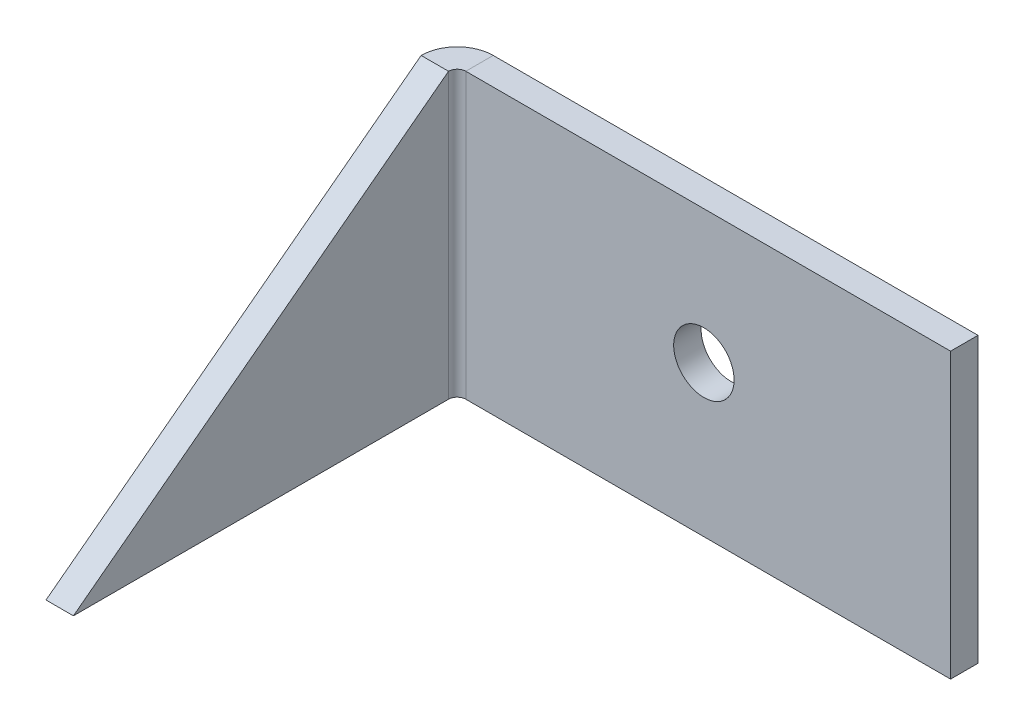
ISO-10303-21;
HEADER;
FILE_DESCRIPTION(('STEP AP214'),'2;1');
FILE_NAME('part.step','',(''),(''),'','','');
FILE_SCHEMA(('AUTOMOTIVE_DESIGN { 1 0 10303 214 1 1 1 1 }'));
ENDSEC;
DATA;
#1=APPLICATION_CONTEXT('core data for automotive mechanical design processes');
#2=APPLICATION_PROTOCOL_DEFINITION('international standard','automotive_design',2000,#1);
#3=PRODUCT_CONTEXT('',#1,'mechanical');
#4=PRODUCT('Part','Part','',(#3));
#5=PRODUCT_RELATED_PRODUCT_CATEGORY('part','',(#4));
#6=PRODUCT_DEFINITION_FORMATION('','',#4);
#7=PRODUCT_DEFINITION_CONTEXT('part definition',#1,'design');
#8=PRODUCT_DEFINITION('design','',#6,#7);
#9=PRODUCT_DEFINITION_SHAPE('','',#8);
#10=(LENGTH_UNIT() NAMED_UNIT(*) SI_UNIT(.MILLI.,.METRE.));
#11=(NAMED_UNIT(*) PLANE_ANGLE_UNIT() SI_UNIT($,.RADIAN.));
#12=(NAMED_UNIT(*) SI_UNIT($,.STERADIAN.) SOLID_ANGLE_UNIT());
#13=UNCERTAINTY_MEASURE_WITH_UNIT(LENGTH_MEASURE(1.E-05),#10,'distance_accuracy_value','');
#14=(GEOMETRIC_REPRESENTATION_CONTEXT(3) GLOBAL_UNCERTAINTY_ASSIGNED_CONTEXT((#13)) GLOBAL_UNIT_ASSIGNED_CONTEXT((#10,
#11,#12)) REPRESENTATION_CONTEXT('',''));
#15=CARTESIAN_POINT('',(0.,0.,0.));
#16=DIRECTION('',(0.,0.,1.));
#17=DIRECTION('',(1.,0.,0.));
#18=AXIS2_PLACEMENT_3D('',#15,#16,#17);
#19=CARTESIAN_POINT('',(-28.575,-17.4625,3.175));
#20=DIRECTION('',(0.,1.,0.));
#21=DIRECTION('',(0.,0.,1.));
#22=AXIS2_PLACEMENT_3D('',#19,#20,#21);
#23=PLANE('',#22);
#24=DIRECTION('',(0.,0.,-1.));
#25=VECTOR('',#24,1.);
#26=CARTESIAN_POINT('',(-27.575,-17.4625,3.175));
#27=LINE('',#26,#25);
#28=CARTESIAN_POINT('',(-27.575,-17.4625,3.175));
#29=VERTEX_POINT('',#28);
#30=CARTESIAN_POINT('',(-27.575,-17.4625,0.));
#31=VERTEX_POINT('',#30);
#32=EDGE_CURVE('E130',#29,#31,#27,.T.);
#33=ORIENTED_EDGE('',*,*,#32,.T.);
#34=DIRECTION('',(1.,0.,0.));
#35=VECTOR('',#34,1.);
#36=CARTESIAN_POINT('',(-28.575,-17.4625,0.));
#37=LINE('',#36,#35);
#38=CARTESIAN_POINT('',(28.575,-17.4625,0.));
#39=VERTEX_POINT('',#38);
#40=EDGE_CURVE('E165',#31,#39,#37,.T.);
#41=ORIENTED_EDGE('',*,*,#40,.T.);
#42=DIRECTION('',(0.,0.,-1.));
#43=VECTOR('',#42,1.);
#44=CARTESIAN_POINT('',(28.575,-17.4625,3.175));
#45=LINE('',#44,#43);
#46=CARTESIAN_POINT('',(28.575,-17.4625,3.175));
#47=VERTEX_POINT('',#46);
#48=EDGE_CURVE('E11',#47,#39,#45,.T.);
#49=ORIENTED_EDGE('',*,*,#48,.F.);
#50=DIRECTION('',(1.,0.,0.));
#51=VECTOR('',#50,1.);
#52=CARTESIAN_POINT('',(-28.575,-17.4625,3.175));
#53=LINE('',#52,#51);
#54=EDGE_CURVE('E46',#29,#47,#53,.T.);
#55=ORIENTED_EDGE('',*,*,#54,.F.);
#56=EDGE_LOOP('',(#33,#41,#49,#55));
#57=FACE_BOUND('',#56,.T.);
#58=ADVANCED_FACE('F38',(#57),#23,.F.);
#59=CARTESIAN_POINT('',(0.,0.,3.175));
#60=DIRECTION('',(0.,0.,1.));
#61=DIRECTION('',(1.,0.,0.));
#62=AXIS2_PLACEMENT_3D('',#59,#60,#61);
#63=PLANE('',#62);
#64=CARTESIAN_POINT('',(0.,0.,3.175));
#65=DIRECTION('',(0.,0.,1.));
#66=DIRECTION('',(1.,0.,0.));
#67=AXIS2_PLACEMENT_3D('',#64,#65,#66);
#68=CIRCLE('',#67,3.5);
#69=CARTESIAN_POINT('',(3.5,0.,3.175));
#70=VERTEX_POINT('',#69);
#71=EDGE_CURVE('E147',#70,#70,#68,.T.);
#72=ORIENTED_EDGE('',*,*,#71,.F.);
#73=EDGE_LOOP('',(#72));
#74=FACE_BOUND('',#73,.T.);
#75=DIRECTION('',(1.,0.,0.));
#76=VECTOR('',#75,1.);
#77=CARTESIAN_POINT('',(0.,15.43812,3.175));
#78=LINE('',#77,#76);
#79=CARTESIAN_POINT('',(-27.575,15.43812,3.175));
#80=VERTEX_POINT('',#79);
#81=CARTESIAN_POINT('',(28.575,15.43812,3.175));
#82=VERTEX_POINT('',#81);
#83=EDGE_CURVE('E154',#80,#82,#78,.T.);
#84=ORIENTED_EDGE('',*,*,#83,.F.);
#85=DIRECTION('',(0.,-1.,0.));
#86=VECTOR('',#85,1.);
#87=CARTESIAN_POINT('',(-27.575,-17.4625,3.175));
#88=LINE('',#87,#86);
#89=EDGE_CURVE('E53',#29,#80,#88,.F.);
#90=ORIENTED_EDGE('',*,*,#89,.F.);
#91=ORIENTED_EDGE('',*,*,#54,.T.);
#92=DIRECTION('',(0.,1.,0.));
#93=VECTOR('',#92,1.);
#94=CARTESIAN_POINT('',(28.575,17.4625,3.175));
#95=LINE('',#94,#93);
#96=EDGE_CURVE('E162',#47,#82,#95,.T.);
#97=ORIENTED_EDGE('',*,*,#96,.T.);
#98=EDGE_LOOP('',(#84,#90,#91,#97));
#99=FACE_BOUND('',#98,.T.);
#100=ADVANCED_FACE('F178',(#74,#99),#63,.T.);
#101=CARTESIAN_POINT('',(0.,0.,0.));
#102=DIRECTION('',(0.,0.,1.));
#103=DIRECTION('',(1.,0.,0.));
#104=AXIS2_PLACEMENT_3D('',#101,#102,#103);
#105=PLANE('',#104);
#106=CARTESIAN_POINT('',(0.,0.,0.));
#107=DIRECTION('',(0.,0.,1.));
#108=DIRECTION('',(1.,0.,0.));
#109=AXIS2_PLACEMENT_3D('',#106,#107,#108);
#110=CIRCLE('',#109,3.5);
#111=CARTESIAN_POINT('',(3.5,0.,0.));
#112=VERTEX_POINT('',#111);
#113=EDGE_CURVE('E151',#112,#112,#110,.T.);
#114=ORIENTED_EDGE('',*,*,#113,.T.);
#115=EDGE_LOOP('',(#114));
#116=FACE_BOUND('',#115,.T.);
#117=DIRECTION('',(0.,-1.,0.));
#118=VECTOR('',#117,1.);
#119=CARTESIAN_POINT('',(-27.575,-17.4625,0.));
#120=LINE('',#119,#118);
#121=CARTESIAN_POINT('',(-27.575,15.43812,0.));
#122=VERTEX_POINT('',#121);
#123=EDGE_CURVE('E131',#31,#122,#120,.F.);
#124=ORIENTED_EDGE('',*,*,#123,.T.);
#125=DIRECTION('',(1.,0.,0.));
#126=VECTOR('',#125,1.);
#127=CARTESIAN_POINT('',(0.,15.43812,0.));
#128=LINE('',#127,#126);
#129=CARTESIAN_POINT('',(28.575,15.43812,0.));
#130=VERTEX_POINT('',#129);
#131=EDGE_CURVE('E155',#122,#130,#128,.T.);
#132=ORIENTED_EDGE('',*,*,#131,.T.);
#133=DIRECTION('',(0.,1.,0.));
#134=VECTOR('',#133,1.);
#135=CARTESIAN_POINT('',(28.575,17.4625,0.));
#136=LINE('',#135,#134);
#137=EDGE_CURVE('E161',#39,#130,#136,.T.);
#138=ORIENTED_EDGE('',*,*,#137,.F.);
#139=ORIENTED_EDGE('',*,*,#40,.F.);
#140=EDGE_LOOP('',(#124,#132,#138,#139));
#141=FACE_BOUND('',#140,.T.);
#142=ADVANCED_FACE('F175',(#116,#141),#105,.F.);
#143=CARTESIAN_POINT('',(0.,15.43812,0.));
#144=DIRECTION('',(0.,-1.,0.));
#145=DIRECTION('',(0.,0.,-1.));
#146=AXIS2_PLACEMENT_3D('',#143,#144,#145);
#147=PLANE('',#146);
#148=DIRECTION('',(0.,0.,-1.));
#149=VECTOR('',#148,1.);
#150=CARTESIAN_POINT('',(-27.575,15.43812,3.175));
#151=LINE('',#150,#149);
#152=EDGE_CURVE('E61',#80,#122,#151,.T.);
#153=ORIENTED_EDGE('',*,*,#152,.F.);
#154=ORIENTED_EDGE('',*,*,#83,.T.);
#155=DIRECTION('',(0.,0.,1.));
#156=VECTOR('',#155,1.);
#157=CARTESIAN_POINT('',(28.575,15.43812,0.));
#158=LINE('',#157,#156);
#159=EDGE_CURVE('E157',#130,#82,#158,.T.);
#160=ORIENTED_EDGE('',*,*,#159,.F.);
#161=ORIENTED_EDGE('',*,*,#131,.F.);
#162=EDGE_LOOP('',(#153,#154,#160,#161));
#163=FACE_BOUND('',#162,.T.);
#164=ADVANCED_FACE('F177',(#163),#147,.F.);
#165=CARTESIAN_POINT('',(28.575,17.4625,3.175));
#166=DIRECTION('',(-1.,0.,0.));
#167=DIRECTION('',(0.,-1.,0.));
#168=AXIS2_PLACEMENT_3D('',#165,#166,#167);
#169=PLANE('',#168);
#170=ORIENTED_EDGE('',*,*,#137,.T.);
#171=ORIENTED_EDGE('',*,*,#159,.T.);
#172=ORIENTED_EDGE('',*,*,#96,.F.);
#173=ORIENTED_EDGE('',*,*,#48,.T.);
#174=EDGE_LOOP('',(#170,#171,#172,#173));
#175=FACE_BOUND('',#174,.T.);
#176=ADVANCED_FACE('F40',(#175),#169,.F.);
#177=CARTESIAN_POINT('',(0.,0.,3.175));
#178=DIRECTION('',(0.,0.,1.));
#179=DIRECTION('',(1.,0.,0.));
#180=AXIS2_PLACEMENT_3D('',#177,#178,#179);
#181=CYLINDRICAL_SURFACE('',#180,3.5);
#182=ORIENTED_EDGE('',*,*,#113,.F.);
#183=EDGE_LOOP('',(#182));
#184=FACE_BOUND('',#183,.T.);
#185=ORIENTED_EDGE('',*,*,#71,.T.);
#186=EDGE_LOOP('',(#185));
#187=FACE_BOUND('',#186,.T.);
#188=ADVANCED_FACE('F219',(#184,#187),#181,.F.);
#189=CARTESIAN_POINT('',(-27.575,15.43812,4.175));
#190=DIRECTION('',(0.,1.,0.));
#191=DIRECTION('',(0.,0.,1.));
#192=AXIS2_PLACEMENT_3D('',#189,#190,#191);
#193=PLANE('',#192);
#194=DIRECTION('',(-1.,0.,0.));
#195=VECTOR('',#194,1.);
#196=CARTESIAN_POINT('',(-28.575,15.43812,4.175));
#197=LINE('',#196,#195);
#198=CARTESIAN_POINT('',(-28.5750000000001,15.43812,4.175));
#199=VERTEX_POINT('',#198);
#200=CARTESIAN_POINT('',(-31.75,15.43812,4.17499999999999));
#201=VERTEX_POINT('',#200);
#202=EDGE_CURVE('E96',#199,#201,#197,.T.);
#203=ORIENTED_EDGE('',*,*,#202,.F.);
#204=CARTESIAN_POINT('',(-27.575,15.43812,4.175));
#205=DIRECTION('',(0.,-1.,0.));
#206=DIRECTION('',(0.,0.,-1.));
#207=AXIS2_PLACEMENT_3D('',#204,#205,#206);
#208=CIRCLE('',#207,1.);
#209=EDGE_CURVE('E140',#80,#199,#208,.F.);
#210=ORIENTED_EDGE('',*,*,#209,.F.);
#211=ORIENTED_EDGE('',*,*,#152,.T.);
#212=CARTESIAN_POINT('',(-27.575,15.43812,4.175));
#213=DIRECTION('',(0.,-1.,0.));
#214=DIRECTION('',(0.,0.,-1.));
#215=AXIS2_PLACEMENT_3D('',#212,#213,#214);
#216=CIRCLE('',#215,4.175);
#217=EDGE_CURVE('E122',#122,#201,#216,.F.);
#218=ORIENTED_EDGE('',*,*,#217,.T.);
#219=EDGE_LOOP('',(#203,#210,#211,#218));
#220=FACE_BOUND('',#219,.T.);
#221=ADVANCED_FACE('F129',(#220),#193,.T.);
#222=CARTESIAN_POINT('',(-27.575,-17.4625,4.175));
#223=DIRECTION('',(0.,1.,0.));
#224=DIRECTION('',(0.,0.,1.));
#225=AXIS2_PLACEMENT_3D('',#222,#223,#224);
#226=PLANE('',#225);
#227=CARTESIAN_POINT('',(-27.575,-17.4625,4.175));
#228=DIRECTION('',(0.,-1.,0.));
#229=DIRECTION('',(0.,0.,-1.));
#230=AXIS2_PLACEMENT_3D('',#227,#228,#229);
#231=CIRCLE('',#230,1.);
#232=CARTESIAN_POINT('',(-28.575,-17.4625,4.175));
#233=VERTEX_POINT('',#232);
#234=EDGE_CURVE('E143',#233,#29,#231,.T.);
#235=ORIENTED_EDGE('',*,*,#234,.F.);
#236=DIRECTION('',(-1.,0.,0.));
#237=VECTOR('',#236,1.);
#238=CARTESIAN_POINT('',(-28.575,-17.4625,4.175));
#239=LINE('',#238,#237);
#240=CARTESIAN_POINT('',(-31.75,-17.4625,4.17499999999999));
#241=VERTEX_POINT('',#240);
#242=EDGE_CURVE('E127',#233,#241,#239,.T.);
#243=ORIENTED_EDGE('',*,*,#242,.T.);
#244=CARTESIAN_POINT('',(-27.575,-17.4625,4.175));
#245=DIRECTION('',(0.,-1.,0.));
#246=DIRECTION('',(0.,0.,-1.));
#247=AXIS2_PLACEMENT_3D('',#244,#245,#246);
#248=CIRCLE('',#247,4.175);
#249=EDGE_CURVE('E124',#241,#31,#248,.T.);
#250=ORIENTED_EDGE('',*,*,#249,.T.);
#251=ORIENTED_EDGE('',*,*,#32,.F.);
#252=EDGE_LOOP('',(#235,#243,#250,#251));
#253=FACE_BOUND('',#252,.T.);
#254=ADVANCED_FACE('F181',(#253),#226,.F.);
#255=CARTESIAN_POINT('',(-27.575,-17.4625,4.175));
#256=DIRECTION('',(0.,-1.,0.));
#257=DIRECTION('',(-1.,0.,0.));
#258=AXIS2_PLACEMENT_3D('',#255,#256,#257);
#259=CYLINDRICAL_SURFACE('',#258,4.175);
#260=ORIENTED_EDGE('',*,*,#123,.F.);
#261=ORIENTED_EDGE('',*,*,#249,.F.);
#262=DIRECTION('',(0.,1.,0.));
#263=VECTOR('',#262,1.);
#264=CARTESIAN_POINT('',(-31.75,0.,4.17499999999999));
#265=LINE('',#264,#263);
#266=EDGE_CURVE('E113',#241,#201,#265,.T.);
#267=ORIENTED_EDGE('',*,*,#266,.T.);
#268=ORIENTED_EDGE('',*,*,#217,.F.);
#269=EDGE_LOOP('',(#260,#261,#267,#268));
#270=FACE_BOUND('',#269,.T.);
#271=ADVANCED_FACE('F121',(#270),#259,.T.);
#272=CARTESIAN_POINT('',(-27.575,-17.4625,4.175));
#273=DIRECTION('',(0.,-1.,0.));
#274=DIRECTION('',(-1.,0.,0.));
#275=AXIS2_PLACEMENT_3D('',#272,#273,#274);
#276=CYLINDRICAL_SURFACE('',#275,1.);
#277=ORIENTED_EDGE('',*,*,#89,.T.);
#278=ORIENTED_EDGE('',*,*,#209,.T.);
#279=DIRECTION('',(0.,-1.,0.));
#280=VECTOR('',#279,1.);
#281=CARTESIAN_POINT('',(-28.575,15.43812,4.175));
#282=LINE('',#281,#280);
#283=EDGE_CURVE('E107',#199,#233,#282,.T.);
#284=ORIENTED_EDGE('',*,*,#283,.T.);
#285=ORIENTED_EDGE('',*,*,#234,.T.);
#286=EDGE_LOOP('',(#277,#278,#284,#285));
#287=FACE_BOUND('',#286,.T.);
#288=ADVANCED_FACE('F184',(#287),#276,.F.);
#289=CARTESIAN_POINT('',(-31.7500000000002,-17.4625,47.625));
#290=DIRECTION('',(0.,1.,0.));
#291=DIRECTION('',(-1.,0.,0.));
#292=AXIS2_PLACEMENT_3D('',#289,#290,#291);
#293=PLANE('',#292);
#294=ORIENTED_EDGE('',*,*,#242,.F.);
#295=DIRECTION('',(0.,0.,1.));
#296=VECTOR('',#295,1.);
#297=CARTESIAN_POINT('',(-28.5750000000002,-17.4625,47.625));
#298=LINE('',#297,#296);
#299=CARTESIAN_POINT('',(-28.5750000000001,-17.4625,47.625));
#300=VERTEX_POINT('',#299);
#301=EDGE_CURVE('E126',#233,#300,#298,.T.);
#302=ORIENTED_EDGE('',*,*,#301,.T.);
#303=DIRECTION('',(1.,0.,0.));
#304=VECTOR('',#303,1.);
#305=CARTESIAN_POINT('',(-31.7500000000002,-17.4625,47.625));
#306=LINE('',#305,#304);
#307=CARTESIAN_POINT('',(-31.7500000000002,-17.4625,47.625));
#308=VERTEX_POINT('',#307);
#309=EDGE_CURVE('E146',#308,#300,#306,.T.);
#310=ORIENTED_EDGE('',*,*,#309,.F.);
#311=DIRECTION('',(0.,0.,1.));
#312=VECTOR('',#311,1.);
#313=CARTESIAN_POINT('',(-31.7500000000002,-17.4625,47.625));
#314=LINE('',#313,#312);
#315=EDGE_CURVE('E115',#241,#308,#314,.T.);
#316=ORIENTED_EDGE('',*,*,#315,.F.);
#317=EDGE_LOOP('',(#294,#302,#310,#316));
#318=FACE_BOUND('',#317,.T.);
#319=ADVANCED_FACE('F196',(#318),#293,.F.);
#320=CARTESIAN_POINT('',(-31.75,0.,-1.11451597218056E-13));
#321=DIRECTION('',(1.,0.,0.));
#322=DIRECTION('',(0.,0.,-1.));
#323=AXIS2_PLACEMENT_3D('',#320,#321,#322);
#324=PLANE('',#323);
#325=ORIENTED_EDGE('',*,*,#315,.T.);
#326=DIRECTION('',(0.,-0.603670604082378,0.797233843841829));
#327=VECTOR('',#326,1.);
#328=CARTESIAN_POINT('',(-31.75,11.8214763312387,8.95129805783832));
#329=LINE('',#328,#327);
#330=EDGE_CURVE('E99',#201,#308,#329,.T.);
#331=ORIENTED_EDGE('',*,*,#330,.F.);
#332=ORIENTED_EDGE('',*,*,#266,.F.);
#333=EDGE_LOOP('',(#325,#331,#332));
#334=FACE_BOUND('',#333,.T.);
#335=ADVANCED_FACE('F112',(#334),#324,.F.);
#336=CARTESIAN_POINT('',(-28.575,0.,-1.0036614396723E-13));
#337=DIRECTION('',(1.,0.,0.));
#338=DIRECTION('',(0.,0.,-1.));
#339=AXIS2_PLACEMENT_3D('',#336,#337,#338);
#340=PLANE('',#339);
#341=DIRECTION('',(0.,0.603670604082378,-0.797233843841829));
#342=VECTOR('',#341,1.);
#343=CARTESIAN_POINT('',(-28.575,11.8214763312387,8.95129805783832));
#344=LINE('',#343,#342);
#345=EDGE_CURVE('E102',#300,#199,#344,.T.);
#346=ORIENTED_EDGE('',*,*,#345,.F.);
#347=ORIENTED_EDGE('',*,*,#301,.F.);
#348=ORIENTED_EDGE('',*,*,#283,.F.);
#349=EDGE_LOOP('',(#346,#347,#348));
#350=FACE_BOUND('',#349,.T.);
#351=ADVANCED_FACE('F195',(#350),#340,.T.);
#352=CARTESIAN_POINT('',(28.5750000000001,11.8214763312387,8.95129805783852));
#353=DIRECTION('',(0.,-0.797233843841828,-0.603670604082378));
#354=DIRECTION('',(0.,0.603670604082378,-0.797233843841829));
#355=AXIS2_PLACEMENT_3D('',#352,#353,#354);
#356=PLANE('',#355);
#357=ORIENTED_EDGE('',*,*,#345,.T.);
#358=ORIENTED_EDGE('',*,*,#202,.T.);
#359=ORIENTED_EDGE('',*,*,#330,.T.);
#360=ORIENTED_EDGE('',*,*,#309,.T.);
#361=EDGE_LOOP('',(#357,#358,#359,#360));
#362=FACE_BOUND('',#361,.T.);
#363=ADVANCED_FACE('F98',(#362),#356,.F.);
#364=CLOSED_SHELL('',(#58,#100,#142,#164,#176,#188,#221,#254,#271,#288,#319,#335,#351,#363));
#365=MANIFOLD_SOLID_BREP('B2',#364);
#366=ADVANCED_BREP_SHAPE_REPRESENTATION('',(#18,#365),#14);
#367=SHAPE_DEFINITION_REPRESENTATION(#9,#366);
ENDSEC;
END-ISO-10303-21;
